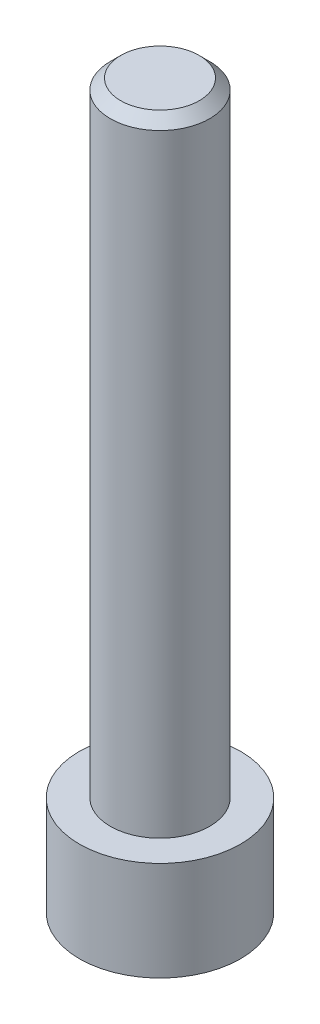
ISO-10303-21;
HEADER;
FILE_DESCRIPTION(('STEP AP214'),'2;1');
FILE_NAME('part.step','',(''),(''),'','','');
FILE_SCHEMA(('AUTOMOTIVE_DESIGN { 1 0 10303 214 1 1 1 1 }'));
ENDSEC;
DATA;
#1=APPLICATION_CONTEXT('core data for automotive mechanical design processes');
#2=APPLICATION_PROTOCOL_DEFINITION('international standard','automotive_design',2000,#1);
#3=PRODUCT_CONTEXT('',#1,'mechanical');
#4=PRODUCT('Part','Part','',(#3));
#5=PRODUCT_RELATED_PRODUCT_CATEGORY('part','',(#4));
#6=PRODUCT_DEFINITION_FORMATION('','',#4);
#7=PRODUCT_DEFINITION_CONTEXT('part definition',#1,'design');
#8=PRODUCT_DEFINITION('design','',#6,#7);
#9=PRODUCT_DEFINITION_SHAPE('','',#8);
#10=(LENGTH_UNIT() NAMED_UNIT(*) SI_UNIT(.MILLI.,.METRE.));
#11=(NAMED_UNIT(*) PLANE_ANGLE_UNIT() SI_UNIT($,.RADIAN.));
#12=(NAMED_UNIT(*) SI_UNIT($,.STERADIAN.) SOLID_ANGLE_UNIT());
#13=UNCERTAINTY_MEASURE_WITH_UNIT(LENGTH_MEASURE(1.E-05),#10,'distance_accuracy_value','');
#14=(GEOMETRIC_REPRESENTATION_CONTEXT(3) GLOBAL_UNCERTAINTY_ASSIGNED_CONTEXT((#13)) GLOBAL_UNIT_ASSIGNED_CONTEXT((#10,
#11,#12)) REPRESENTATION_CONTEXT('',''));
#15=CARTESIAN_POINT('',(0.,0.,0.));
#16=DIRECTION('',(0.,0.,1.));
#17=DIRECTION('',(1.,0.,0.));
#18=AXIS2_PLACEMENT_3D('',#15,#16,#17);
#19=CARTESIAN_POINT('',(0.,34.78,0.));
#20=DIRECTION('',(0.,-1.,0.));
#21=DIRECTION('',(0.,0.,-1.));
#22=AXIS2_PLACEMENT_3D('',#19,#20,#21);
#23=CYLINDRICAL_SURFACE('',#22,3.875);
#24=CARTESIAN_POINT('',(0.,0.,0.));
#25=DIRECTION('',(0.,1.,0.));
#26=DIRECTION('',(0.,0.,1.));
#27=AXIS2_PLACEMENT_3D('',#24,#25,#26);
#28=CIRCLE('',#27,3.875);
#29=CARTESIAN_POINT('',(0.,0.,3.875));
#30=VERTEX_POINT('',#29);
#31=EDGE_CURVE('E149',#30,#30,#28,.T.);
#32=ORIENTED_EDGE('',*,*,#31,.T.);
#33=EDGE_LOOP('',(#32));
#34=FACE_BOUND('',#33,.T.);
#35=CARTESIAN_POINT('',(0.,4.78,0.));
#36=DIRECTION('',(0.,1.,0.));
#37=DIRECTION('',(0.,0.,1.));
#38=AXIS2_PLACEMENT_3D('',#35,#36,#37);
#39=CIRCLE('',#38,3.875);
#40=CARTESIAN_POINT('',(0.,4.78,3.875));
#41=VERTEX_POINT('',#40);
#42=EDGE_CURVE('E148',#41,#41,#39,.T.);
#43=ORIENTED_EDGE('',*,*,#42,.F.);
#44=EDGE_LOOP('',(#43));
#45=FACE_BOUND('',#44,.T.);
#46=ADVANCED_FACE('F38',(#34,#45),#23,.T.);
#47=CARTESIAN_POINT('',(0.,0.,0.));
#48=DIRECTION('',(0.,1.,0.));
#49=DIRECTION('',(0.,0.,1.));
#50=AXIS2_PLACEMENT_3D('',#47,#48,#49);
#51=PLANE('',#50);
#52=DIRECTION('',(-0.5,0.,0.866025403784439));
#53=VECTOR('',#52,1.);
#54=CARTESIAN_POINT('',(2.64426423288849,0.,0.));
#55=LINE('',#54,#53);
#56=CARTESIAN_POINT('',(2.64426423288849,0.,0.));
#57=VERTEX_POINT('',#56);
#58=CARTESIAN_POINT('',(1.32213211644424,0.,2.29));
#59=VERTEX_POINT('',#58);
#60=EDGE_CURVE('E127',#57,#59,#55,.T.);
#61=ORIENTED_EDGE('',*,*,#60,.F.);
#62=DIRECTION('',(0.5,0.,0.866025403784439));
#63=VECTOR('',#62,1.);
#64=CARTESIAN_POINT('',(1.32213211644424,0.,-2.29));
#65=LINE('',#64,#63);
#66=CARTESIAN_POINT('',(1.32213211644424,0.,-2.29));
#67=VERTEX_POINT('',#66);
#68=EDGE_CURVE('E53',#67,#57,#65,.T.);
#69=ORIENTED_EDGE('',*,*,#68,.F.);
#70=DIRECTION('',(1.,0.,0.));
#71=VECTOR('',#70,1.);
#72=CARTESIAN_POINT('',(-1.32213211644424,0.,-2.29));
#73=LINE('',#72,#71);
#74=CARTESIAN_POINT('',(-1.32213211644424,0.,-2.29));
#75=VERTEX_POINT('',#74);
#76=EDGE_CURVE('E136',#75,#67,#73,.T.);
#77=ORIENTED_EDGE('',*,*,#76,.F.);
#78=DIRECTION('',(0.5,0.,-0.866025403784439));
#79=VECTOR('',#78,1.);
#80=CARTESIAN_POINT('',(-2.64426423288849,0.,0.));
#81=LINE('',#80,#79);
#82=CARTESIAN_POINT('',(-2.64426423288849,0.,0.));
#83=VERTEX_POINT('',#82);
#84=EDGE_CURVE('E134',#83,#75,#81,.T.);
#85=ORIENTED_EDGE('',*,*,#84,.F.);
#86=DIRECTION('',(-0.5,0.,-0.866025403784439));
#87=VECTOR('',#86,1.);
#88=CARTESIAN_POINT('',(-1.32213211644424,0.,2.29));
#89=LINE('',#88,#87);
#90=CARTESIAN_POINT('',(-1.32213211644424,0.,2.29));
#91=VERTEX_POINT('',#90);
#92=EDGE_CURVE('E101',#91,#83,#89,.T.);
#93=ORIENTED_EDGE('',*,*,#92,.F.);
#94=DIRECTION('',(-1.,0.,0.));
#95=VECTOR('',#94,1.);
#96=CARTESIAN_POINT('',(1.32213211644424,0.,2.29));
#97=LINE('',#96,#95);
#98=EDGE_CURVE('E130',#59,#91,#97,.T.);
#99=ORIENTED_EDGE('',*,*,#98,.F.);
#100=EDGE_LOOP('',(#61,#69,#77,#85,#93,#99));
#101=FACE_BOUND('',#100,.T.);
#102=ORIENTED_EDGE('',*,*,#31,.F.);
#103=EDGE_LOOP('',(#102));
#104=FACE_BOUND('',#103,.T.);
#105=ADVANCED_FACE('F171',(#101,#104),#51,.F.);
#106=CARTESIAN_POINT('',(0.,4.78,0.));
#107=DIRECTION('',(0.,1.,0.));
#108=DIRECTION('',(0.,0.,1.));
#109=AXIS2_PLACEMENT_3D('',#106,#107,#108);
#110=PLANE('',#109);
#111=CARTESIAN_POINT('',(0.,4.78,0.));
#112=DIRECTION('',(0.,1.,0.));
#113=DIRECTION('',(0.,0.,1.));
#114=AXIS2_PLACEMENT_3D('',#111,#112,#113);
#115=CIRCLE('',#114,2.39);
#116=CARTESIAN_POINT('',(0.,4.78,2.39));
#117=VERTEX_POINT('',#116);
#118=EDGE_CURVE('E140',#117,#117,#115,.T.);
#119=ORIENTED_EDGE('',*,*,#118,.F.);
#120=EDGE_LOOP('',(#119));
#121=FACE_BOUND('',#120,.T.);
#122=ORIENTED_EDGE('',*,*,#42,.T.);
#123=EDGE_LOOP('',(#122));
#124=FACE_BOUND('',#123,.T.);
#125=ADVANCED_FACE('F176',(#121,#124),#110,.T.);
#126=CARTESIAN_POINT('',(0.,4.78,0.));
#127=DIRECTION('',(0.,1.,0.));
#128=DIRECTION('',(0.,0.,1.));
#129=AXIS2_PLACEMENT_3D('',#126,#127,#128);
#130=CYLINDRICAL_SURFACE('',#129,2.39);
#131=CARTESIAN_POINT('',(0.,34.28,0.));
#132=DIRECTION('',(0.,1.,0.));
#133=DIRECTION('',(0.,0.,1.));
#134=AXIS2_PLACEMENT_3D('',#131,#132,#133);
#135=CIRCLE('',#134,2.39);
#136=CARTESIAN_POINT('',(0.,34.28,2.39));
#137=VERTEX_POINT('',#136);
#138=EDGE_CURVE('E12',#137,#137,#135,.F.);
#139=ORIENTED_EDGE('',*,*,#138,.T.);
#140=EDGE_LOOP('',(#139));
#141=FACE_BOUND('',#140,.T.);
#142=ORIENTED_EDGE('',*,*,#118,.T.);
#143=EDGE_LOOP('',(#142));
#144=FACE_BOUND('',#143,.T.);
#145=ADVANCED_FACE('F167',(#141,#144),#130,.T.);
#146=CARTESIAN_POINT('',(0.,34.78,0.));
#147=DIRECTION('',(0.,1.,0.));
#148=DIRECTION('',(0.,0.,1.));
#149=AXIS2_PLACEMENT_3D('',#146,#147,#148);
#150=PLANE('',#149);
#151=CARTESIAN_POINT('',(0.,34.78,0.));
#152=DIRECTION('',(0.,1.,0.));
#153=DIRECTION('',(0.,0.,1.));
#154=AXIS2_PLACEMENT_3D('',#151,#152,#153);
#155=CIRCLE('',#154,1.89);
#156=CARTESIAN_POINT('',(0.,34.78,1.89));
#157=VERTEX_POINT('',#156);
#158=EDGE_CURVE('E46',#157,#157,#155,.T.);
#159=ORIENTED_EDGE('',*,*,#158,.T.);
#160=EDGE_LOOP('',(#159));
#161=FACE_BOUND('',#160,.T.);
#162=ADVANCED_FACE('F156',(#161),#150,.T.);
#163=CARTESIAN_POINT('',(0.,34.78,0.));
#164=DIRECTION('',(0.,-1.,0.));
#165=DIRECTION('',(0.,0.,-1.));
#166=AXIS2_PLACEMENT_3D('',#163,#164,#165);
#167=CONICAL_SURFACE('',#166,1.89,0.785398163397452);
#168=ORIENTED_EDGE('',*,*,#138,.F.);
#169=EDGE_LOOP('',(#168));
#170=FACE_BOUND('',#169,.T.);
#171=ORIENTED_EDGE('',*,*,#158,.F.);
#172=EDGE_LOOP('',(#171));
#173=FACE_BOUND('',#172,.T.);
#174=ADVANCED_FACE('F40',(#170,#173),#167,.T.);
#175=CARTESIAN_POINT('',(1.32213211644424,3.36,-2.29));
#176=DIRECTION('',(0.866025403784439,0.,-0.5));
#177=DIRECTION('',(-0.5,0.,-0.866025403784439));
#178=AXIS2_PLACEMENT_3D('',#175,#176,#177);
#179=PLANE('',#178);
#180=ORIENTED_EDGE('',*,*,#68,.T.);
#181=DIRECTION('',(0.,-1.,0.));
#182=VECTOR('',#181,1.);
#183=CARTESIAN_POINT('',(2.64426423288849,3.36,0.));
#184=LINE('',#183,#182);
#185=CARTESIAN_POINT('',(2.64426423288849,3.36,0.));
#186=VERTEX_POINT('',#185);
#187=EDGE_CURVE('E83',#186,#57,#184,.T.);
#188=ORIENTED_EDGE('',*,*,#187,.F.);
#189=DIRECTION('',(0.5,0.,0.866025403784439));
#190=VECTOR('',#189,1.);
#191=CARTESIAN_POINT('',(1.32213211644424,3.36,-2.29));
#192=LINE('',#191,#190);
#193=CARTESIAN_POINT('',(1.32213211644424,3.36,-2.29));
#194=VERTEX_POINT('',#193);
#195=EDGE_CURVE('E138',#194,#186,#192,.T.);
#196=ORIENTED_EDGE('',*,*,#195,.F.);
#197=DIRECTION('',(0.,-1.,0.));
#198=VECTOR('',#197,1.);
#199=CARTESIAN_POINT('',(1.32213211644424,3.36,-2.29));
#200=LINE('',#199,#198);
#201=EDGE_CURVE('E61',#194,#67,#200,.T.);
#202=ORIENTED_EDGE('',*,*,#201,.T.);
#203=EDGE_LOOP('',(#180,#188,#196,#202));
#204=FACE_BOUND('',#203,.T.);
#205=ADVANCED_FACE('F159',(#204),#179,.F.);
#206=CARTESIAN_POINT('',(-1.32213211644424,3.36,-2.29));
#207=DIRECTION('',(0.,0.,-1.));
#208=DIRECTION('',(-1.,0.,0.));
#209=AXIS2_PLACEMENT_3D('',#206,#207,#208);
#210=PLANE('',#209);
#211=ORIENTED_EDGE('',*,*,#76,.T.);
#212=ORIENTED_EDGE('',*,*,#201,.F.);
#213=DIRECTION('',(1.,0.,0.));
#214=VECTOR('',#213,1.);
#215=CARTESIAN_POINT('',(-1.32213211644424,3.36,-2.29));
#216=LINE('',#215,#214);
#217=CARTESIAN_POINT('',(-1.32213211644424,3.36,-2.29));
#218=VERTEX_POINT('',#217);
#219=EDGE_CURVE('E113',#218,#194,#216,.T.);
#220=ORIENTED_EDGE('',*,*,#219,.F.);
#221=DIRECTION('',(0.,-1.,0.));
#222=VECTOR('',#221,1.);
#223=CARTESIAN_POINT('',(-1.32213211644424,3.36,-2.29));
#224=LINE('',#223,#222);
#225=EDGE_CURVE('E105',#218,#75,#224,.T.);
#226=ORIENTED_EDGE('',*,*,#225,.T.);
#227=EDGE_LOOP('',(#211,#212,#220,#226));
#228=FACE_BOUND('',#227,.T.);
#229=ADVANCED_FACE('F165',(#228),#210,.F.);
#230=CARTESIAN_POINT('',(-2.64426423288849,3.36,0.));
#231=DIRECTION('',(-0.866025403784438,0.,-0.5));
#232=DIRECTION('',(-0.5,0.,0.866025403784439));
#233=AXIS2_PLACEMENT_3D('',#230,#231,#232);
#234=PLANE('',#233);
#235=ORIENTED_EDGE('',*,*,#84,.T.);
#236=ORIENTED_EDGE('',*,*,#225,.F.);
#237=DIRECTION('',(0.5,0.,-0.866025403784439));
#238=VECTOR('',#237,1.);
#239=CARTESIAN_POINT('',(-2.64426423288849,3.36,0.));
#240=LINE('',#239,#238);
#241=CARTESIAN_POINT('',(-2.64426423288849,3.36,0.));
#242=VERTEX_POINT('',#241);
#243=EDGE_CURVE('E109',#242,#218,#240,.T.);
#244=ORIENTED_EDGE('',*,*,#243,.F.);
#245=DIRECTION('',(0.,-1.,0.));
#246=VECTOR('',#245,1.);
#247=CARTESIAN_POINT('',(-2.64426423288849,3.36,0.));
#248=LINE('',#247,#246);
#249=EDGE_CURVE('E94',#242,#83,#248,.T.);
#250=ORIENTED_EDGE('',*,*,#249,.T.);
#251=EDGE_LOOP('',(#235,#236,#244,#250));
#252=FACE_BOUND('',#251,.T.);
#253=ADVANCED_FACE('F110',(#252),#234,.F.);
#254=CARTESIAN_POINT('',(-1.32213211644424,3.36,2.29));
#255=DIRECTION('',(-0.866025403784439,0.,0.5));
#256=DIRECTION('',(0.5,0.,0.866025403784439));
#257=AXIS2_PLACEMENT_3D('',#254,#255,#256);
#258=PLANE('',#257);
#259=ORIENTED_EDGE('',*,*,#92,.T.);
#260=ORIENTED_EDGE('',*,*,#249,.F.);
#261=DIRECTION('',(-0.5,0.,-0.866025403784439));
#262=VECTOR('',#261,1.);
#263=CARTESIAN_POINT('',(-1.32213211644424,3.36,2.29));
#264=LINE('',#263,#262);
#265=CARTESIAN_POINT('',(-1.32213211644424,3.36,2.29));
#266=VERTEX_POINT('',#265);
#267=EDGE_CURVE('E98',#266,#242,#264,.T.);
#268=ORIENTED_EDGE('',*,*,#267,.F.);
#269=DIRECTION('',(0.,-1.,0.));
#270=VECTOR('',#269,1.);
#271=CARTESIAN_POINT('',(-1.32213211644424,3.36,2.29));
#272=LINE('',#271,#270);
#273=EDGE_CURVE('E106',#266,#91,#272,.T.);
#274=ORIENTED_EDGE('',*,*,#273,.T.);
#275=EDGE_LOOP('',(#259,#260,#268,#274));
#276=FACE_BOUND('',#275,.T.);
#277=ADVANCED_FACE('F96',(#276),#258,.F.);
#278=CARTESIAN_POINT('',(1.32213211644424,3.36,2.29));
#279=DIRECTION('',(0.,0.,1.));
#280=DIRECTION('',(1.,0.,0.));
#281=AXIS2_PLACEMENT_3D('',#278,#279,#280);
#282=PLANE('',#281);
#283=ORIENTED_EDGE('',*,*,#98,.T.);
#284=ORIENTED_EDGE('',*,*,#273,.F.);
#285=DIRECTION('',(-1.,0.,0.));
#286=VECTOR('',#285,1.);
#287=CARTESIAN_POINT('',(1.32213211644424,3.36,2.29));
#288=LINE('',#287,#286);
#289=CARTESIAN_POINT('',(1.32213211644424,3.36,2.29));
#290=VERTEX_POINT('',#289);
#291=EDGE_CURVE('E119',#290,#266,#288,.T.);
#292=ORIENTED_EDGE('',*,*,#291,.F.);
#293=DIRECTION('',(0.,-1.,0.));
#294=VECTOR('',#293,1.);
#295=CARTESIAN_POINT('',(1.32213211644424,3.36,2.29));
#296=LINE('',#295,#294);
#297=EDGE_CURVE('E143',#290,#59,#296,.T.);
#298=ORIENTED_EDGE('',*,*,#297,.T.);
#299=EDGE_LOOP('',(#283,#284,#292,#298));
#300=FACE_BOUND('',#299,.T.);
#301=ADVANCED_FACE('F190',(#300),#282,.F.);
#302=CARTESIAN_POINT('',(2.64426423288849,3.36,0.));
#303=DIRECTION('',(0.866025403784439,0.,0.5));
#304=DIRECTION('',(0.5,0.,-0.866025403784439));
#305=AXIS2_PLACEMENT_3D('',#302,#303,#304);
#306=PLANE('',#305);
#307=ORIENTED_EDGE('',*,*,#60,.T.);
#308=ORIENTED_EDGE('',*,*,#297,.F.);
#309=DIRECTION('',(-0.5,0.,0.866025403784439));
#310=VECTOR('',#309,1.);
#311=CARTESIAN_POINT('',(2.64426423288849,3.36,0.));
#312=LINE('',#311,#310);
#313=EDGE_CURVE('E121',#186,#290,#312,.T.);
#314=ORIENTED_EDGE('',*,*,#313,.F.);
#315=ORIENTED_EDGE('',*,*,#187,.T.);
#316=EDGE_LOOP('',(#307,#308,#314,#315));
#317=FACE_BOUND('',#316,.T.);
#318=ADVANCED_FACE('F187',(#317),#306,.F.);
#319=CARTESIAN_POINT('',(0.,3.36,0.));
#320=DIRECTION('',(0.,-1.,0.));
#321=DIRECTION('',(0.,0.,-1.));
#322=AXIS2_PLACEMENT_3D('',#319,#320,#321);
#323=PLANE('',#322);
#324=ORIENTED_EDGE('',*,*,#195,.T.);
#325=ORIENTED_EDGE('',*,*,#313,.T.);
#326=ORIENTED_EDGE('',*,*,#291,.T.);
#327=ORIENTED_EDGE('',*,*,#267,.T.);
#328=ORIENTED_EDGE('',*,*,#243,.T.);
#329=ORIENTED_EDGE('',*,*,#219,.T.);
#330=EDGE_LOOP('',(#324,#325,#326,#327,#328,#329));
#331=FACE_BOUND('',#330,.T.);
#332=ADVANCED_FACE('F116',(#331),#323,.T.);
#333=CLOSED_SHELL('',(#46,#105,#125,#145,#162,#174,#205,#229,#253,#277,#301,#318,#332));
#334=MANIFOLD_SOLID_BREP('B2',#333);
#335=ADVANCED_BREP_SHAPE_REPRESENTATION('',(#18,#334),#14);
#336=SHAPE_DEFINITION_REPRESENTATION(#9,#335);
ENDSEC;
END-ISO-10303-21;
